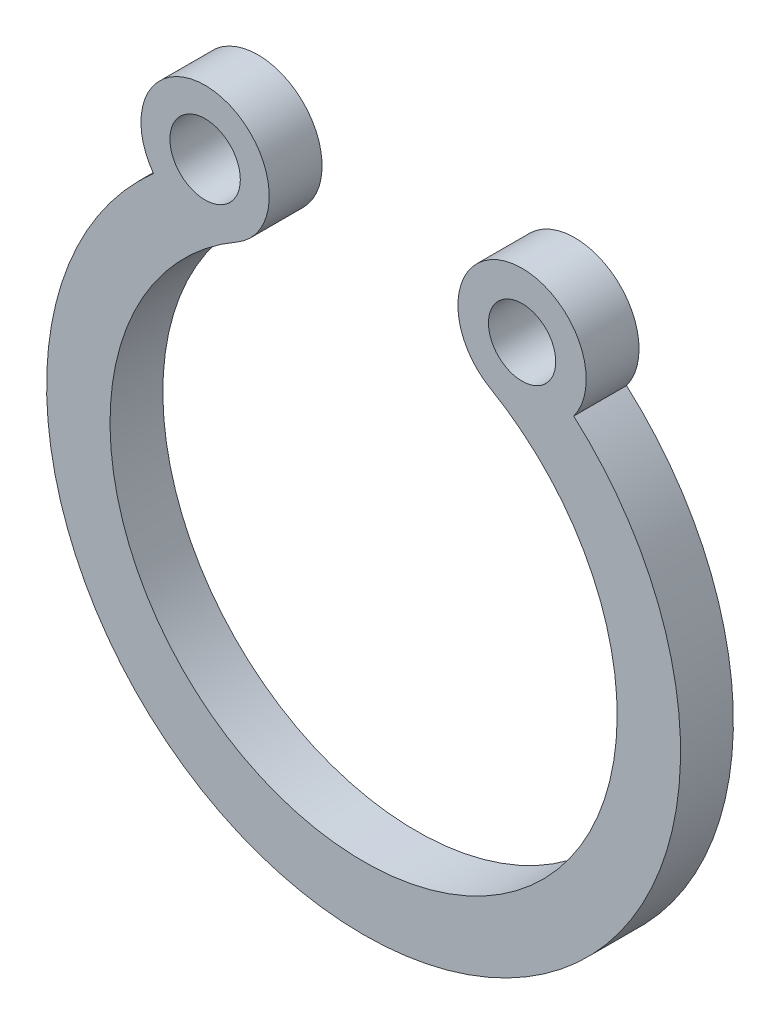
ISO-10303-21;
HEADER;
FILE_DESCRIPTION(('STEP AP214'),'2;1');
FILE_NAME('part.step','',(''),(''),'','','');
FILE_SCHEMA(('AUTOMOTIVE_DESIGN { 1 0 10303 214 1 1 1 1 }'));
ENDSEC;
DATA;
#1=APPLICATION_CONTEXT('core data for automotive mechanical design processes');
#2=APPLICATION_PROTOCOL_DEFINITION('international standard','automotive_design',2000,#1);
#3=PRODUCT_CONTEXT('',#1,'mechanical');
#4=PRODUCT('Part','Part','',(#3));
#5=PRODUCT_RELATED_PRODUCT_CATEGORY('part','',(#4));
#6=PRODUCT_DEFINITION_FORMATION('','',#4);
#7=PRODUCT_DEFINITION_CONTEXT('part definition',#1,'design');
#8=PRODUCT_DEFINITION('design','',#6,#7);
#9=PRODUCT_DEFINITION_SHAPE('','',#8);
#10=(LENGTH_UNIT() NAMED_UNIT(*) SI_UNIT(.MILLI.,.METRE.));
#11=(NAMED_UNIT(*) PLANE_ANGLE_UNIT() SI_UNIT($,.RADIAN.));
#12=(NAMED_UNIT(*) SI_UNIT($,.STERADIAN.) SOLID_ANGLE_UNIT());
#13=UNCERTAINTY_MEASURE_WITH_UNIT(LENGTH_MEASURE(1.E-05),#10,'distance_accuracy_value','');
#14=(GEOMETRIC_REPRESENTATION_CONTEXT(3) GLOBAL_UNCERTAINTY_ASSIGNED_CONTEXT((#13)) GLOBAL_UNIT_ASSIGNED_CONTEXT((#10,
#11,#12)) REPRESENTATION_CONTEXT('',''));
#15=CARTESIAN_POINT('',(0.,0.,0.));
#16=DIRECTION('',(0.,0.,1.));
#17=DIRECTION('',(1.,0.,0.));
#18=AXIS2_PLACEMENT_3D('',#15,#16,#17);
#19=CARTESIAN_POINT('',(0.,0.,1.));
#20=DIRECTION('',(0.,0.,-1.));
#21=DIRECTION('',(-1.,0.,0.));
#22=AXIS2_PLACEMENT_3D('',#19,#20,#21);
#23=CYLINDRICAL_SURFACE('',#22,6.);
#24=CARTESIAN_POINT('',(0.,0.,0.));
#25=DIRECTION('',(0.,0.,1.));
#26=DIRECTION('',(1.,0.,0.));
#27=AXIS2_PLACEMENT_3D('',#24,#25,#26);
#28=CIRCLE('',#27,6.);
#29=CARTESIAN_POINT('',(-3.97747115082341,4.49218468502438,0.));
#30=VERTEX_POINT('',#29);
#31=CARTESIAN_POINT('',(3.9774711508234,4.49218468502438,0.));
#32=VERTEX_POINT('',#31);
#33=EDGE_CURVE('E99',#30,#32,#28,.T.);
#34=ORIENTED_EDGE('',*,*,#33,.T.);
#35=DIRECTION('',(0.,0.,-1.));
#36=VECTOR('',#35,1.);
#37=CARTESIAN_POINT('',(3.9774711508234,4.49218468502438,1.));
#38=LINE('',#37,#36);
#39=CARTESIAN_POINT('',(3.9774711508234,4.49218468502438,1.));
#40=VERTEX_POINT('',#39);
#41=EDGE_CURVE('E11',#40,#32,#38,.T.);
#42=ORIENTED_EDGE('',*,*,#41,.F.);
#43=CARTESIAN_POINT('',(0.,0.,1.));
#44=DIRECTION('',(0.,0.,1.));
#45=DIRECTION('',(1.,0.,0.));
#46=AXIS2_PLACEMENT_3D('',#43,#44,#45);
#47=CIRCLE('',#46,6.);
#48=CARTESIAN_POINT('',(-3.97747115082341,4.49218468502438,1.));
#49=VERTEX_POINT('',#48);
#50=EDGE_CURVE('E87',#49,#40,#47,.T.);
#51=ORIENTED_EDGE('',*,*,#50,.F.);
#52=DIRECTION('',(0.,0.,-1.));
#53=VECTOR('',#52,1.);
#54=CARTESIAN_POINT('',(-3.97747115082341,4.49218468502438,1.));
#55=LINE('',#54,#53);
#56=EDGE_CURVE('E95',#49,#30,#55,.T.);
#57=ORIENTED_EDGE('',*,*,#56,.T.);
#58=EDGE_LOOP('',(#34,#42,#51,#57));
#59=FACE_BOUND('',#58,.T.);
#60=ADVANCED_FACE('F36',(#59),#23,.T.);
#61=CARTESIAN_POINT('',(3.,5.21266910531997,1.));
#62=DIRECTION('',(0.,0.,-1.));
#63=DIRECTION('',(-1.,0.,0.));
#64=AXIS2_PLACEMENT_3D('',#61,#62,#63);
#65=CYLINDRICAL_SURFACE('',#64,1.21430953656006);
#66=CARTESIAN_POINT('',(3.,5.21266910531997,0.));
#67=DIRECTION('',(0.,0.,1.));
#68=DIRECTION('',(1.,0.,0.));
#69=AXIS2_PLACEMENT_3D('',#66,#67,#68);
#70=CIRCLE('',#69,1.21430953656006);
#71=CARTESIAN_POINT('',(2.39428980375297,4.16021349640191,0.));
#72=VERTEX_POINT('',#71);
#73=EDGE_CURVE('E91',#32,#72,#70,.T.);
#74=ORIENTED_EDGE('',*,*,#73,.T.);
#75=DIRECTION('',(0.,0.,-1.));
#76=VECTOR('',#75,1.);
#77=CARTESIAN_POINT('',(2.39428980375297,4.16021349640191,1.));
#78=LINE('',#77,#76);
#79=CARTESIAN_POINT('',(2.39428980375297,4.16021349640191,1.));
#80=VERTEX_POINT('',#79);
#81=EDGE_CURVE('E44',#80,#72,#78,.T.);
#82=ORIENTED_EDGE('',*,*,#81,.F.);
#83=CARTESIAN_POINT('',(3.,5.21266910531997,1.));
#84=DIRECTION('',(0.,0.,1.));
#85=DIRECTION('',(1.,0.,0.));
#86=AXIS2_PLACEMENT_3D('',#83,#84,#85);
#87=CIRCLE('',#86,1.21430953656006);
#88=EDGE_CURVE('E82',#40,#80,#87,.T.);
#89=ORIENTED_EDGE('',*,*,#88,.F.);
#90=ORIENTED_EDGE('',*,*,#41,.T.);
#91=EDGE_LOOP('',(#74,#82,#89,#90));
#92=FACE_BOUND('',#91,.T.);
#93=ADVANCED_FACE('F90',(#92),#65,.T.);
#94=CARTESIAN_POINT('',(0.,0.,1.));
#95=DIRECTION('',(0.,0.,-1.));
#96=DIRECTION('',(-1.,0.,0.));
#97=AXIS2_PLACEMENT_3D('',#94,#95,#96);
#98=CYLINDRICAL_SURFACE('',#97,4.8);
#99=CARTESIAN_POINT('',(0.,0.,0.));
#100=DIRECTION('',(0.,0.,-1.));
#101=DIRECTION('',(1.,0.,0.));
#102=AXIS2_PLACEMENT_3D('',#99,#100,#101);
#103=CIRCLE('',#102,4.8);
#104=CARTESIAN_POINT('',(-2.39428980375297,4.16021349640191,0.));
#105=VERTEX_POINT('',#104);
#106=EDGE_CURVE('E69',#72,#105,#103,.T.);
#107=ORIENTED_EDGE('',*,*,#106,.T.);
#108=DIRECTION('',(0.,0.,-1.));
#109=VECTOR('',#108,1.);
#110=CARTESIAN_POINT('',(-2.39428980375297,4.16021349640191,1.));
#111=LINE('',#110,#109);
#112=CARTESIAN_POINT('',(-2.39428980375297,4.16021349640191,1.));
#113=VERTEX_POINT('',#112);
#114=EDGE_CURVE('E92',#113,#105,#111,.T.);
#115=ORIENTED_EDGE('',*,*,#114,.F.);
#116=CARTESIAN_POINT('',(0.,0.,1.));
#117=DIRECTION('',(0.,0.,-1.));
#118=DIRECTION('',(1.,0.,0.));
#119=AXIS2_PLACEMENT_3D('',#116,#117,#118);
#120=CIRCLE('',#119,4.8);
#121=EDGE_CURVE('E85',#80,#113,#120,.T.);
#122=ORIENTED_EDGE('',*,*,#121,.F.);
#123=ORIENTED_EDGE('',*,*,#81,.T.);
#124=EDGE_LOOP('',(#107,#115,#122,#123));
#125=FACE_BOUND('',#124,.T.);
#126=ADVANCED_FACE('F93',(#125),#98,.F.);
#127=CARTESIAN_POINT('',(-3.,5.21266910531997,1.));
#128=DIRECTION('',(0.,0.,-1.));
#129=DIRECTION('',(-1.,0.,0.));
#130=AXIS2_PLACEMENT_3D('',#127,#128,#129);
#131=CYLINDRICAL_SURFACE('',#130,1.21430953656006);
#132=CARTESIAN_POINT('',(-3.,5.21266910531997,0.));
#133=DIRECTION('',(0.,0.,1.));
#134=DIRECTION('',(1.,0.,0.));
#135=AXIS2_PLACEMENT_3D('',#132,#133,#134);
#136=CIRCLE('',#135,1.21430953656006);
#137=EDGE_CURVE('E75',#105,#30,#136,.T.);
#138=ORIENTED_EDGE('',*,*,#137,.T.);
#139=ORIENTED_EDGE('',*,*,#56,.F.);
#140=CARTESIAN_POINT('',(-3.,5.21266910531997,1.));
#141=DIRECTION('',(0.,0.,1.));
#142=DIRECTION('',(1.,0.,0.));
#143=AXIS2_PLACEMENT_3D('',#140,#141,#142);
#144=CIRCLE('',#143,1.21430953656006);
#145=EDGE_CURVE('E52',#113,#49,#144,.T.);
#146=ORIENTED_EDGE('',*,*,#145,.F.);
#147=ORIENTED_EDGE('',*,*,#114,.T.);
#148=EDGE_LOOP('',(#138,#139,#146,#147));
#149=FACE_BOUND('',#148,.T.);
#150=ADVANCED_FACE('F107',(#149),#131,.T.);
#151=CARTESIAN_POINT('',(1.5,2.60633455265998,1.));
#152=DIRECTION('',(0.,0.,1.));
#153=DIRECTION('',(1.,0.,0.));
#154=AXIS2_PLACEMENT_3D('',#151,#152,#153);
#155=PLANE('',#154);
#156=CARTESIAN_POINT('',(-3.,5.21266910531997,1.));
#157=DIRECTION('',(0.,0.,1.));
#158=DIRECTION('',(1.,0.,0.));
#159=AXIS2_PLACEMENT_3D('',#156,#157,#158);
#160=CIRCLE('',#159,0.666692756624095);
#161=CARTESIAN_POINT('',(-2.33330724337591,5.21266910531997,1.));
#162=VERTEX_POINT('',#161);
#163=EDGE_CURVE('E119',#162,#162,#160,.T.);
#164=ORIENTED_EDGE('',*,*,#163,.F.);
#165=EDGE_LOOP('',(#164));
#166=FACE_BOUND('',#165,.T.);
#167=CARTESIAN_POINT('',(3.,5.21266910531997,1.));
#168=DIRECTION('',(0.,0.,1.));
#169=DIRECTION('',(1.,0.,0.));
#170=AXIS2_PLACEMENT_3D('',#167,#168,#169);
#171=CIRCLE('',#170,0.63681637698406);
#172=CARTESIAN_POINT('',(3.63681637698406,5.21266910531997,1.));
#173=VERTEX_POINT('',#172);
#174=EDGE_CURVE('E113',#173,#173,#171,.T.);
#175=ORIENTED_EDGE('',*,*,#174,.F.);
#176=EDGE_LOOP('',(#175));
#177=FACE_BOUND('',#176,.T.);
#178=ORIENTED_EDGE('',*,*,#50,.T.);
#179=ORIENTED_EDGE('',*,*,#88,.T.);
#180=ORIENTED_EDGE('',*,*,#121,.T.);
#181=ORIENTED_EDGE('',*,*,#145,.T.);
#182=EDGE_LOOP('',(#178,#179,#180,#181));
#183=FACE_BOUND('',#182,.T.);
#184=ADVANCED_FACE('F83',(#166,#177,#183),#155,.T.);
#185=CARTESIAN_POINT('',(1.5,2.60633455265998,0.));
#186=DIRECTION('',(0.,0.,1.));
#187=DIRECTION('',(1.,0.,0.));
#188=AXIS2_PLACEMENT_3D('',#185,#186,#187);
#189=PLANE('',#188);
#190=CARTESIAN_POINT('',(-3.,5.21266910531997,0.));
#191=DIRECTION('',(0.,0.,1.));
#192=DIRECTION('',(1.,0.,0.));
#193=AXIS2_PLACEMENT_3D('',#190,#191,#192);
#194=CIRCLE('',#193,0.666692756624095);
#195=CARTESIAN_POINT('',(-2.33330724337591,5.21266910531997,0.));
#196=VERTEX_POINT('',#195);
#197=EDGE_CURVE('E102',#196,#196,#194,.T.);
#198=ORIENTED_EDGE('',*,*,#197,.T.);
#199=EDGE_LOOP('',(#198));
#200=FACE_BOUND('',#199,.T.);
#201=CARTESIAN_POINT('',(3.,5.21266910531997,0.));
#202=DIRECTION('',(0.,0.,1.));
#203=DIRECTION('',(1.,0.,0.));
#204=AXIS2_PLACEMENT_3D('',#201,#202,#203);
#205=CIRCLE('',#204,0.63681637698406);
#206=CARTESIAN_POINT('',(3.63681637698406,5.21266910531997,0.));
#207=VERTEX_POINT('',#206);
#208=EDGE_CURVE('E116',#207,#207,#205,.T.);
#209=ORIENTED_EDGE('',*,*,#208,.T.);
#210=EDGE_LOOP('',(#209));
#211=FACE_BOUND('',#210,.T.);
#212=ORIENTED_EDGE('',*,*,#33,.F.);
#213=ORIENTED_EDGE('',*,*,#137,.F.);
#214=ORIENTED_EDGE('',*,*,#106,.F.);
#215=ORIENTED_EDGE('',*,*,#73,.F.);
#216=EDGE_LOOP('',(#212,#213,#214,#215));
#217=FACE_BOUND('',#216,.T.);
#218=ADVANCED_FACE('F110',(#200,#211,#217),#189,.F.);
#219=CARTESIAN_POINT('',(3.,5.21266910531997,0.));
#220=DIRECTION('',(0.,0.,1.));
#221=DIRECTION('',(1.,0.,0.));
#222=AXIS2_PLACEMENT_3D('',#219,#220,#221);
#223=CYLINDRICAL_SURFACE('',#222,0.63681637698406);
#224=ORIENTED_EDGE('',*,*,#208,.F.);
#225=EDGE_LOOP('',(#224));
#226=FACE_BOUND('',#225,.T.);
#227=ORIENTED_EDGE('',*,*,#174,.T.);
#228=EDGE_LOOP('',(#227));
#229=FACE_BOUND('',#228,.T.);
#230=ADVANCED_FACE('F130',(#226,#229),#223,.F.);
#231=CARTESIAN_POINT('',(-3.,5.21266910531997,0.));
#232=DIRECTION('',(0.,0.,1.));
#233=DIRECTION('',(1.,0.,0.));
#234=AXIS2_PLACEMENT_3D('',#231,#232,#233);
#235=CYLINDRICAL_SURFACE('',#234,0.666692756624095);
#236=ORIENTED_EDGE('',*,*,#197,.F.);
#237=EDGE_LOOP('',(#236));
#238=FACE_BOUND('',#237,.T.);
#239=ORIENTED_EDGE('',*,*,#163,.T.);
#240=EDGE_LOOP('',(#239));
#241=FACE_BOUND('',#240,.T.);
#242=ADVANCED_FACE('F127',(#238,#241),#235,.F.);
#243=CLOSED_SHELL('',(#60,#93,#126,#150,#184,#218,#230,#242));
#244=MANIFOLD_SOLID_BREP('B2',#243);
#245=ADVANCED_BREP_SHAPE_REPRESENTATION('',(#18,#244),#14);
#246=SHAPE_DEFINITION_REPRESENTATION(#9,#245);
ENDSEC;
END-ISO-10303-21;
